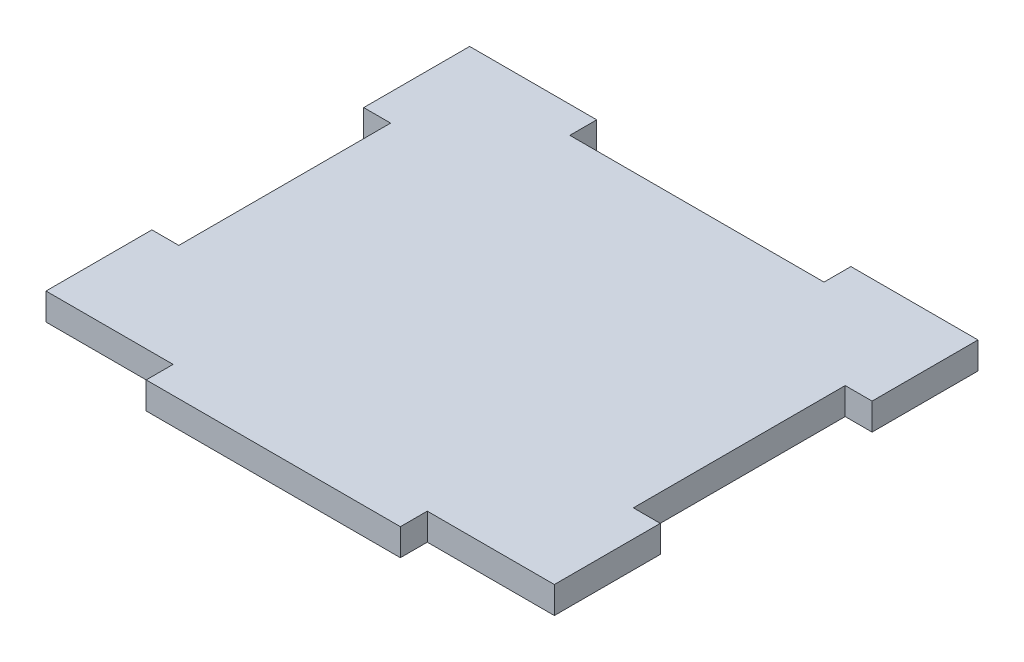
ISO-10303-21;
HEADER;
FILE_DESCRIPTION(('STEP AP214'),'2;1');
FILE_NAME('part.step','',(''),(''),'','','');
FILE_SCHEMA(('AUTOMOTIVE_DESIGN { 1 0 10303 214 1 1 1 1 }'));
ENDSEC;
DATA;
#1=APPLICATION_CONTEXT('core data for automotive mechanical design processes');
#2=APPLICATION_PROTOCOL_DEFINITION('international standard','automotive_design',2000,#1);
#3=PRODUCT_CONTEXT('',#1,'mechanical');
#4=PRODUCT('Part','Part','',(#3));
#5=PRODUCT_RELATED_PRODUCT_CATEGORY('part','',(#4));
#6=PRODUCT_DEFINITION_FORMATION('','',#4);
#7=PRODUCT_DEFINITION_CONTEXT('part definition',#1,'design');
#8=PRODUCT_DEFINITION('design','',#6,#7);
#9=PRODUCT_DEFINITION_SHAPE('','',#8);
#10=(LENGTH_UNIT() NAMED_UNIT(*) SI_UNIT(.MILLI.,.METRE.));
#11=(NAMED_UNIT(*) PLANE_ANGLE_UNIT() SI_UNIT($,.RADIAN.));
#12=(NAMED_UNIT(*) SI_UNIT($,.STERADIAN.) SOLID_ANGLE_UNIT());
#13=UNCERTAINTY_MEASURE_WITH_UNIT(LENGTH_MEASURE(1.E-05),#10,'distance_accuracy_value','');
#14=(GEOMETRIC_REPRESENTATION_CONTEXT(3) GLOBAL_UNCERTAINTY_ASSIGNED_CONTEXT((#13)) GLOBAL_UNIT_ASSIGNED_CONTEXT((#10,
#11,#12)) REPRESENTATION_CONTEXT('',''));
#15=CARTESIAN_POINT('',(0.,0.,0.));
#16=DIRECTION('',(0.,0.,1.));
#17=DIRECTION('',(1.,0.,0.));
#18=AXIS2_PLACEMENT_3D('',#15,#16,#17);
#19=CARTESIAN_POINT('',(30.,3.175,25.));
#20=DIRECTION('',(-1.,0.,0.));
#21=DIRECTION('',(0.,0.,1.));
#22=AXIS2_PLACEMENT_3D('',#19,#20,#21);
#23=PLANE('',#22);
#24=DIRECTION('',(0.,0.,-1.));
#25=VECTOR('',#24,1.);
#26=CARTESIAN_POINT('',(30.,0.,25.));
#27=LINE('',#26,#25);
#28=CARTESIAN_POINT('',(30.,0.,25.));
#29=VERTEX_POINT('',#28);
#30=CARTESIAN_POINT('',(30.,0.,12.5));
#31=VERTEX_POINT('',#30);
#32=EDGE_CURVE('E385',#29,#31,#27,.T.);
#33=ORIENTED_EDGE('',*,*,#32,.T.);
#34=DIRECTION('',(0.,1.,0.));
#35=VECTOR('',#34,1.);
#36=CARTESIAN_POINT('',(30.,0.,12.5));
#37=LINE('',#36,#35);
#38=CARTESIAN_POINT('',(30.,3.175,12.5));
#39=VERTEX_POINT('',#38);
#40=EDGE_CURVE('E277',#31,#39,#37,.T.);
#41=ORIENTED_EDGE('',*,*,#40,.T.);
#42=DIRECTION('',(0.,0.,-1.));
#43=VECTOR('',#42,1.);
#44=CARTESIAN_POINT('',(30.,3.175,25.));
#45=LINE('',#44,#43);
#46=CARTESIAN_POINT('',(30.,3.175,25.));
#47=VERTEX_POINT('',#46);
#48=EDGE_CURVE('E371',#47,#39,#45,.T.);
#49=ORIENTED_EDGE('',*,*,#48,.F.);
#50=DIRECTION('',(0.,-1.,0.));
#51=VECTOR('',#50,1.);
#52=CARTESIAN_POINT('',(30.,3.175,25.));
#53=LINE('',#52,#51);
#54=EDGE_CURVE('E219',#47,#29,#53,.T.);
#55=ORIENTED_EDGE('',*,*,#54,.T.);
#56=EDGE_LOOP('',(#33,#41,#49,#55));
#57=FACE_BOUND('',#56,.T.);
#58=ADVANCED_FACE('F39',(#57),#23,.F.);
#59=CARTESIAN_POINT('',(-30.,3.175,25.));
#60=DIRECTION('',(1.,0.,0.));
#61=DIRECTION('',(0.,0.,-1.));
#62=AXIS2_PLACEMENT_3D('',#59,#60,#61);
#63=PLANE('',#62);
#64=DIRECTION('',(0.,0.,1.));
#65=VECTOR('',#64,1.);
#66=CARTESIAN_POINT('',(-30.,0.,25.));
#67=LINE('',#66,#65);
#68=CARTESIAN_POINT('',(-30.,0.,-25.));
#69=VERTEX_POINT('',#68);
#70=CARTESIAN_POINT('',(-30.,0.,-12.5));
#71=VERTEX_POINT('',#70);
#72=EDGE_CURVE('E204',#69,#71,#67,.T.);
#73=ORIENTED_EDGE('',*,*,#72,.T.);
#74=DIRECTION('',(0.,1.,0.));
#75=VECTOR('',#74,1.);
#76=CARTESIAN_POINT('',(-30.,0.,-12.5));
#77=LINE('',#76,#75);
#78=CARTESIAN_POINT('',(-30.,3.175,-12.5));
#79=VERTEX_POINT('',#78);
#80=EDGE_CURVE('E257',#71,#79,#77,.T.);
#81=ORIENTED_EDGE('',*,*,#80,.T.);
#82=DIRECTION('',(0.,0.,1.));
#83=VECTOR('',#82,1.);
#84=CARTESIAN_POINT('',(-30.,3.175,25.));
#85=LINE('',#84,#83);
#86=CARTESIAN_POINT('',(-30.,3.175,-25.));
#87=VERTEX_POINT('',#86);
#88=EDGE_CURVE('E235',#87,#79,#85,.T.);
#89=ORIENTED_EDGE('',*,*,#88,.F.);
#90=DIRECTION('',(0.,-1.,0.));
#91=VECTOR('',#90,1.);
#92=CARTESIAN_POINT('',(-30.,3.175,-25.));
#93=LINE('',#92,#91);
#94=EDGE_CURVE('E48',#87,#69,#93,.T.);
#95=ORIENTED_EDGE('',*,*,#94,.T.);
#96=EDGE_LOOP('',(#73,#81,#89,#95));
#97=FACE_BOUND('',#96,.T.);
#98=ADVANCED_FACE('F232',(#97),#63,.F.);
#99=CARTESIAN_POINT('',(-30.,3.175,25.));
#100=DIRECTION('',(0.,0.,-1.));
#101=DIRECTION('',(-1.,0.,0.));
#102=AXIS2_PLACEMENT_3D('',#99,#100,#101);
#103=PLANE('',#102);
#104=DIRECTION('',(0.,1.,0.));
#105=VECTOR('',#104,1.);
#106=CARTESIAN_POINT('',(15.,-30.1675425747607,25.));
#107=LINE('',#106,#105);
#108=CARTESIAN_POINT('',(15.,0.,25.));
#109=VERTEX_POINT('',#108);
#110=CARTESIAN_POINT('',(15.,3.175,25.));
#111=VERTEX_POINT('',#110);
#112=EDGE_CURVE('E314',#109,#111,#107,.T.);
#113=ORIENTED_EDGE('',*,*,#112,.F.);
#114=DIRECTION('',(1.,0.,0.));
#115=VECTOR('',#114,1.);
#116=CARTESIAN_POINT('',(-30.,0.,25.));
#117=LINE('',#116,#115);
#118=EDGE_CURVE('E210',#109,#29,#117,.T.);
#119=ORIENTED_EDGE('',*,*,#118,.T.);
#120=ORIENTED_EDGE('',*,*,#54,.F.);
#121=DIRECTION('',(1.,0.,0.));
#122=VECTOR('',#121,1.);
#123=CARTESIAN_POINT('',(-30.,3.175,25.));
#124=LINE('',#123,#122);
#125=EDGE_CURVE('E382',#111,#47,#124,.T.);
#126=ORIENTED_EDGE('',*,*,#125,.F.);
#127=EDGE_LOOP('',(#113,#119,#120,#126));
#128=FACE_BOUND('',#127,.T.);
#129=ADVANCED_FACE('F413',(#128),#103,.F.);
#130=CARTESIAN_POINT('',(-30.,3.175,-25.));
#131=DIRECTION('',(0.,0.,1.));
#132=DIRECTION('',(1.,0.,0.));
#133=AXIS2_PLACEMENT_3D('',#130,#131,#132);
#134=PLANE('',#133);
#135=DIRECTION('',(-1.,0.,0.));
#136=VECTOR('',#135,1.);
#137=CARTESIAN_POINT('',(-30.,3.175,-25.));
#138=LINE('',#137,#136);
#139=CARTESIAN_POINT('',(-15.,3.175,-25.));
#140=VERTEX_POINT('',#139);
#141=EDGE_CURVE('E375',#140,#87,#138,.T.);
#142=ORIENTED_EDGE('',*,*,#141,.F.);
#143=DIRECTION('',(0.,1.,0.));
#144=VECTOR('',#143,1.);
#145=CARTESIAN_POINT('',(-15.,0.,-25.));
#146=LINE('',#145,#144);
#147=CARTESIAN_POINT('',(-15.,0.,-25.));
#148=VERTEX_POINT('',#147);
#149=EDGE_CURVE('E358',#148,#140,#146,.T.);
#150=ORIENTED_EDGE('',*,*,#149,.F.);
#151=DIRECTION('',(-1.,0.,0.));
#152=VECTOR('',#151,1.);
#153=CARTESIAN_POINT('',(-30.,0.,-25.));
#154=LINE('',#153,#152);
#155=EDGE_CURVE('E212',#148,#69,#154,.T.);
#156=ORIENTED_EDGE('',*,*,#155,.T.);
#157=ORIENTED_EDGE('',*,*,#94,.F.);
#158=EDGE_LOOP('',(#142,#150,#156,#157));
#159=FACE_BOUND('',#158,.T.);
#160=ADVANCED_FACE('F425',(#159),#134,.F.);
#161=CARTESIAN_POINT('',(30.,3.175,-12.5));
#162=VERTEX_POINT('',#161);
#163=CARTESIAN_POINT('',(30.,3.175,-25.));
#164=VERTEX_POINT('',#163);
#165=EDGE_CURVE('E218',#162,#164,#45,.T.);
#166=ORIENTED_EDGE('',*,*,#165,.F.);
#167=DIRECTION('',(0.,1.,0.));
#168=VECTOR('',#167,1.);
#169=CARTESIAN_POINT('',(30.,0.,-12.5));
#170=LINE('',#169,#168);
#171=CARTESIAN_POINT('',(30.,0.,-12.5));
#172=VERTEX_POINT('',#171);
#173=EDGE_CURVE('E293',#172,#162,#170,.T.);
#174=ORIENTED_EDGE('',*,*,#173,.F.);
#175=CARTESIAN_POINT('',(30.,0.,-25.));
#176=VERTEX_POINT('',#175);
#177=EDGE_CURVE('E361',#172,#176,#27,.T.);
#178=ORIENTED_EDGE('',*,*,#177,.T.);
#179=DIRECTION('',(0.,-1.,0.));
#180=VECTOR('',#179,1.);
#181=CARTESIAN_POINT('',(30.,3.175,-25.));
#182=LINE('',#181,#180);
#183=EDGE_CURVE('E11',#164,#176,#182,.T.);
#184=ORIENTED_EDGE('',*,*,#183,.F.);
#185=EDGE_LOOP('',(#166,#174,#178,#184));
#186=FACE_BOUND('',#185,.T.);
#187=ADVANCED_FACE('F41',(#186),#23,.F.);
#188=CARTESIAN_POINT('',(15.,0.,-25.));
#189=VERTEX_POINT('',#188);
#190=EDGE_CURVE('E205',#176,#189,#154,.T.);
#191=ORIENTED_EDGE('',*,*,#190,.T.);
#192=DIRECTION('',(0.,1.,0.));
#193=VECTOR('',#192,1.);
#194=CARTESIAN_POINT('',(15.,0.,-25.));
#195=LINE('',#194,#193);
#196=CARTESIAN_POINT('',(15.,3.175,-25.));
#197=VERTEX_POINT('',#196);
#198=EDGE_CURVE('E362',#189,#197,#195,.T.);
#199=ORIENTED_EDGE('',*,*,#198,.T.);
#200=EDGE_CURVE('E376',#164,#197,#138,.T.);
#201=ORIENTED_EDGE('',*,*,#200,.F.);
#202=ORIENTED_EDGE('',*,*,#183,.T.);
#203=EDGE_LOOP('',(#191,#199,#201,#202));
#204=FACE_BOUND('',#203,.T.);
#205=ADVANCED_FACE('F400',(#204),#134,.F.);
#206=CARTESIAN_POINT('',(-30.,3.175,12.5));
#207=VERTEX_POINT('',#206);
#208=CARTESIAN_POINT('',(-30.,3.175,25.));
#209=VERTEX_POINT('',#208);
#210=EDGE_CURVE('E194',#207,#209,#85,.T.);
#211=ORIENTED_EDGE('',*,*,#210,.F.);
#212=DIRECTION('',(0.,1.,0.));
#213=VECTOR('',#212,1.);
#214=CARTESIAN_POINT('',(-30.,0.,12.5));
#215=LINE('',#214,#213);
#216=CARTESIAN_POINT('',(-30.,0.,12.5));
#217=VERTEX_POINT('',#216);
#218=EDGE_CURVE('E180',#217,#207,#215,.T.);
#219=ORIENTED_EDGE('',*,*,#218,.F.);
#220=CARTESIAN_POINT('',(-30.,0.,25.));
#221=VERTEX_POINT('',#220);
#222=EDGE_CURVE('E192',#217,#221,#67,.T.);
#223=ORIENTED_EDGE('',*,*,#222,.T.);
#224=DIRECTION('',(0.,-1.,0.));
#225=VECTOR('',#224,1.);
#226=CARTESIAN_POINT('',(-30.,3.175,25.));
#227=LINE('',#226,#225);
#228=EDGE_CURVE('E223',#209,#221,#227,.T.);
#229=ORIENTED_EDGE('',*,*,#228,.F.);
#230=EDGE_LOOP('',(#211,#219,#223,#229));
#231=FACE_BOUND('',#230,.T.);
#232=ADVANCED_FACE('F190',(#231),#63,.F.);
#233=CARTESIAN_POINT('',(-15.,0.,25.));
#234=VERTEX_POINT('',#233);
#235=EDGE_CURVE('E202',#221,#234,#117,.T.);
#236=ORIENTED_EDGE('',*,*,#235,.T.);
#237=DIRECTION('',(0.,1.,0.));
#238=VECTOR('',#237,1.);
#239=CARTESIAN_POINT('',(-15.,-30.1675425747607,25.));
#240=LINE('',#239,#238);
#241=CARTESIAN_POINT('',(-15.,3.175,25.));
#242=VERTEX_POINT('',#241);
#243=EDGE_CURVE('E325',#234,#242,#240,.T.);
#244=ORIENTED_EDGE('',*,*,#243,.T.);
#245=EDGE_CURVE('E224',#209,#242,#124,.T.);
#246=ORIENTED_EDGE('',*,*,#245,.F.);
#247=ORIENTED_EDGE('',*,*,#228,.T.);
#248=EDGE_LOOP('',(#236,#244,#246,#247));
#249=FACE_BOUND('',#248,.T.);
#250=ADVANCED_FACE('F458',(#249),#103,.F.);
#251=CARTESIAN_POINT('',(0.,3.175,0.));
#252=DIRECTION('',(0.,-1.,0.));
#253=DIRECTION('',(0.,0.,-1.));
#254=AXIS2_PLACEMENT_3D('',#251,#252,#253);
#255=PLANE('',#254);
#256=ORIENTED_EDGE('',*,*,#88,.T.);
#257=DIRECTION('',(-1.,0.,0.));
#258=VECTOR('',#257,1.);
#259=CARTESIAN_POINT('',(-30.,3.175,-12.5));
#260=LINE('',#259,#258);
#261=CARTESIAN_POINT('',(-26.825,3.175,-12.5));
#262=VERTEX_POINT('',#261);
#263=EDGE_CURVE('E186',#262,#79,#260,.T.);
#264=ORIENTED_EDGE('',*,*,#263,.F.);
#265=DIRECTION('',(0.,0.,-1.));
#266=VECTOR('',#265,1.);
#267=CARTESIAN_POINT('',(-26.825,3.175,-12.5));
#268=LINE('',#267,#266);
#269=CARTESIAN_POINT('',(-26.825,3.175,12.5));
#270=VERTEX_POINT('',#269);
#271=EDGE_CURVE('E250',#270,#262,#268,.T.);
#272=ORIENTED_EDGE('',*,*,#271,.F.);
#273=DIRECTION('',(1.,0.,0.));
#274=VECTOR('',#273,1.);
#275=CARTESIAN_POINT('',(-30.,3.175,12.5));
#276=LINE('',#275,#274);
#277=EDGE_CURVE('E247',#207,#270,#276,.T.);
#278=ORIENTED_EDGE('',*,*,#277,.F.);
#279=ORIENTED_EDGE('',*,*,#210,.T.);
#280=ORIENTED_EDGE('',*,*,#245,.T.);
#281=DIRECTION('',(0.,0.,1.));
#282=VECTOR('',#281,1.);
#283=CARTESIAN_POINT('',(-15.0000000000001,3.175,0.));
#284=LINE('',#283,#282);
#285=CARTESIAN_POINT('',(-15.,3.175,28.175));
#286=VERTEX_POINT('',#285);
#287=EDGE_CURVE('E299',#242,#286,#284,.T.);
#288=ORIENTED_EDGE('',*,*,#287,.T.);
#289=DIRECTION('',(1.,0.,0.));
#290=VECTOR('',#289,1.);
#291=CARTESIAN_POINT('',(0.,3.175,28.175));
#292=LINE('',#291,#290);
#293=CARTESIAN_POINT('',(15.,3.175,28.175));
#294=VERTEX_POINT('',#293);
#295=EDGE_CURVE('E260',#286,#294,#292,.T.);
#296=ORIENTED_EDGE('',*,*,#295,.T.);
#297=DIRECTION('',(0.,0.,-1.));
#298=VECTOR('',#297,1.);
#299=CARTESIAN_POINT('',(14.9999999999999,3.175,0.));
#300=LINE('',#299,#298);
#301=EDGE_CURVE('E304',#294,#111,#300,.T.);
#302=ORIENTED_EDGE('',*,*,#301,.T.);
#303=ORIENTED_EDGE('',*,*,#125,.T.);
#304=ORIENTED_EDGE('',*,*,#48,.T.);
#305=DIRECTION('',(1.,0.,0.));
#306=VECTOR('',#305,1.);
#307=CARTESIAN_POINT('',(30.,3.175,12.5));
#308=LINE('',#307,#306);
#309=CARTESIAN_POINT('',(26.825,3.175,12.5));
#310=VERTEX_POINT('',#309);
#311=EDGE_CURVE('E278',#310,#39,#308,.T.);
#312=ORIENTED_EDGE('',*,*,#311,.F.);
#313=DIRECTION('',(0.,0.,1.));
#314=VECTOR('',#313,1.);
#315=CARTESIAN_POINT('',(26.825,3.175,-12.5));
#316=LINE('',#315,#314);
#317=CARTESIAN_POINT('',(26.825,3.175,-12.5));
#318=VERTEX_POINT('',#317);
#319=EDGE_CURVE('E271',#318,#310,#316,.T.);
#320=ORIENTED_EDGE('',*,*,#319,.F.);
#321=DIRECTION('',(-1.,0.,0.));
#322=VECTOR('',#321,1.);
#323=CARTESIAN_POINT('',(30.,3.175,-12.5));
#324=LINE('',#323,#322);
#325=EDGE_CURVE('E281',#162,#318,#324,.T.);
#326=ORIENTED_EDGE('',*,*,#325,.F.);
#327=ORIENTED_EDGE('',*,*,#165,.T.);
#328=ORIENTED_EDGE('',*,*,#200,.T.);
#329=DIRECTION('',(0.,0.,-1.));
#330=VECTOR('',#329,1.);
#331=CARTESIAN_POINT('',(15.,3.175,-25.));
#332=LINE('',#331,#330);
#333=CARTESIAN_POINT('',(15.,3.175,-21.825));
#334=VERTEX_POINT('',#333);
#335=EDGE_CURVE('E340',#334,#197,#332,.T.);
#336=ORIENTED_EDGE('',*,*,#335,.F.);
#337=DIRECTION('',(1.,0.,0.));
#338=VECTOR('',#337,1.);
#339=CARTESIAN_POINT('',(-15.,3.175,-21.825));
#340=LINE('',#339,#338);
#341=CARTESIAN_POINT('',(-15.,3.175,-21.825));
#342=VERTEX_POINT('',#341);
#343=EDGE_CURVE('E352',#342,#334,#340,.T.);
#344=ORIENTED_EDGE('',*,*,#343,.F.);
#345=DIRECTION('',(0.,0.,1.));
#346=VECTOR('',#345,1.);
#347=CARTESIAN_POINT('',(-15.,3.175,-25.));
#348=LINE('',#347,#346);
#349=EDGE_CURVE('E335',#140,#342,#348,.T.);
#350=ORIENTED_EDGE('',*,*,#349,.F.);
#351=ORIENTED_EDGE('',*,*,#141,.T.);
#352=EDGE_LOOP('',(#256,#264,#272,#278,#279,#280,#288,#296,#302,#303,#304,#312,#320,#326,#327,
#328,#336,#344,#350,#351));
#353=FACE_BOUND('',#352,.T.);
#354=ADVANCED_FACE('F403',(#353),#255,.F.);
#355=CARTESIAN_POINT('',(0.,0.,0.));
#356=DIRECTION('',(0.,-1.,0.));
#357=DIRECTION('',(0.,0.,-1.));
#358=AXIS2_PLACEMENT_3D('',#355,#356,#357);
#359=PLANE('',#358);
#360=DIRECTION('',(-1.,0.,0.));
#361=VECTOR('',#360,1.);
#362=CARTESIAN_POINT('',(-30.,0.,-12.5));
#363=LINE('',#362,#361);
#364=CARTESIAN_POINT('',(-26.825,0.,-12.5));
#365=VERTEX_POINT('',#364);
#366=EDGE_CURVE('E196',#365,#71,#363,.T.);
#367=ORIENTED_EDGE('',*,*,#366,.T.);
#368=ORIENTED_EDGE('',*,*,#72,.F.);
#369=ORIENTED_EDGE('',*,*,#155,.F.);
#370=DIRECTION('',(0.,0.,1.));
#371=VECTOR('',#370,1.);
#372=CARTESIAN_POINT('',(-15.,0.,-25.));
#373=LINE('',#372,#371);
#374=CARTESIAN_POINT('',(-15.,0.,-21.825));
#375=VERTEX_POINT('',#374);
#376=EDGE_CURVE('E336',#148,#375,#373,.T.);
#377=ORIENTED_EDGE('',*,*,#376,.T.);
#378=DIRECTION('',(1.,0.,0.));
#379=VECTOR('',#378,1.);
#380=CARTESIAN_POINT('',(-15.,0.,-21.825));
#381=LINE('',#380,#379);
#382=CARTESIAN_POINT('',(15.,0.,-21.825));
#383=VERTEX_POINT('',#382);
#384=EDGE_CURVE('E339',#375,#383,#381,.T.);
#385=ORIENTED_EDGE('',*,*,#384,.T.);
#386=DIRECTION('',(0.,0.,-1.));
#387=VECTOR('',#386,1.);
#388=CARTESIAN_POINT('',(15.,0.,-25.));
#389=LINE('',#388,#387);
#390=EDGE_CURVE('E344',#383,#189,#389,.T.);
#391=ORIENTED_EDGE('',*,*,#390,.T.);
#392=ORIENTED_EDGE('',*,*,#190,.F.);
#393=ORIENTED_EDGE('',*,*,#177,.F.);
#394=DIRECTION('',(-1.,0.,0.));
#395=VECTOR('',#394,1.);
#396=CARTESIAN_POINT('',(30.,0.,-12.5));
#397=LINE('',#396,#395);
#398=CARTESIAN_POINT('',(26.825,0.,-12.5));
#399=VERTEX_POINT('',#398);
#400=EDGE_CURVE('E270',#172,#399,#397,.T.);
#401=ORIENTED_EDGE('',*,*,#400,.T.);
#402=DIRECTION('',(0.,0.,1.));
#403=VECTOR('',#402,1.);
#404=CARTESIAN_POINT('',(26.825,0.,-12.5));
#405=LINE('',#404,#403);
#406=CARTESIAN_POINT('',(26.825,0.,12.5));
#407=VERTEX_POINT('',#406);
#408=EDGE_CURVE('E63',#399,#407,#405,.T.);
#409=ORIENTED_EDGE('',*,*,#408,.T.);
#410=DIRECTION('',(1.,0.,0.));
#411=VECTOR('',#410,1.);
#412=CARTESIAN_POINT('',(30.,0.,12.5));
#413=LINE('',#412,#411);
#414=EDGE_CURVE('E266',#407,#31,#413,.T.);
#415=ORIENTED_EDGE('',*,*,#414,.T.);
#416=ORIENTED_EDGE('',*,*,#32,.F.);
#417=ORIENTED_EDGE('',*,*,#118,.F.);
#418=DIRECTION('',(0.,0.,-1.));
#419=VECTOR('',#418,1.);
#420=CARTESIAN_POINT('',(14.9999999999999,0.,0.));
#421=LINE('',#420,#419);
#422=CARTESIAN_POINT('',(15.,0.,28.175));
#423=VERTEX_POINT('',#422);
#424=EDGE_CURVE('E303',#423,#109,#421,.T.);
#425=ORIENTED_EDGE('',*,*,#424,.F.);
#426=DIRECTION('',(1.,0.,0.));
#427=VECTOR('',#426,1.);
#428=CARTESIAN_POINT('',(0.,0.,28.175));
#429=LINE('',#428,#427);
#430=CARTESIAN_POINT('',(-15.,0.,28.175));
#431=VERTEX_POINT('',#430);
#432=EDGE_CURVE('E315',#431,#423,#429,.T.);
#433=ORIENTED_EDGE('',*,*,#432,.F.);
#434=DIRECTION('',(0.,0.,1.));
#435=VECTOR('',#434,1.);
#436=CARTESIAN_POINT('',(-15.0000000000001,0.,0.));
#437=LINE('',#436,#435);
#438=EDGE_CURVE('E321',#234,#431,#437,.T.);
#439=ORIENTED_EDGE('',*,*,#438,.F.);
#440=ORIENTED_EDGE('',*,*,#235,.F.);
#441=ORIENTED_EDGE('',*,*,#222,.F.);
#442=DIRECTION('',(1.,0.,0.));
#443=VECTOR('',#442,1.);
#444=CARTESIAN_POINT('',(-30.,0.,12.5));
#445=LINE('',#444,#443);
#446=CARTESIAN_POINT('',(-26.825,0.,12.5));
#447=VERTEX_POINT('',#446);
#448=EDGE_CURVE('E176',#217,#447,#445,.T.);
#449=ORIENTED_EDGE('',*,*,#448,.T.);
#450=DIRECTION('',(0.,0.,-1.));
#451=VECTOR('',#450,1.);
#452=CARTESIAN_POINT('',(-26.825,0.,-12.5));
#453=LINE('',#452,#451);
#454=EDGE_CURVE('E55',#447,#365,#453,.T.);
#455=ORIENTED_EDGE('',*,*,#454,.T.);
#456=EDGE_LOOP('',(#367,#368,#369,#377,#385,#391,#392,#393,#401,#409,#415,#416,#417,#425,#433,
#439,#440,#441,#449,#455));
#457=FACE_BOUND('',#456,.T.);
#458=ADVANCED_FACE('F200',(#457),#359,.T.);
#459=CARTESIAN_POINT('',(-15.,0.,-25.));
#460=DIRECTION('',(-1.,0.,0.));
#461=DIRECTION('',(0.,0.,1.));
#462=AXIS2_PLACEMENT_3D('',#459,#460,#461);
#463=PLANE('',#462);
#464=ORIENTED_EDGE('',*,*,#349,.T.);
#465=DIRECTION('',(0.,1.,0.));
#466=VECTOR('',#465,1.);
#467=CARTESIAN_POINT('',(-15.,0.,-21.825));
#468=LINE('',#467,#466);
#469=EDGE_CURVE('E348',#375,#342,#468,.T.);
#470=ORIENTED_EDGE('',*,*,#469,.F.);
#471=ORIENTED_EDGE('',*,*,#376,.F.);
#472=ORIENTED_EDGE('',*,*,#149,.T.);
#473=EDGE_LOOP('',(#464,#470,#471,#472));
#474=FACE_BOUND('',#473,.T.);
#475=ADVANCED_FACE('F427',(#474),#463,.F.);
#476=CARTESIAN_POINT('',(15.,0.,-25.));
#477=DIRECTION('',(1.,0.,0.));
#478=DIRECTION('',(0.,0.,-1.));
#479=AXIS2_PLACEMENT_3D('',#476,#477,#478);
#480=PLANE('',#479);
#481=ORIENTED_EDGE('',*,*,#335,.T.);
#482=ORIENTED_EDGE('',*,*,#198,.F.);
#483=ORIENTED_EDGE('',*,*,#390,.F.);
#484=DIRECTION('',(0.,1.,0.));
#485=VECTOR('',#484,1.);
#486=CARTESIAN_POINT('',(15.,0.,-21.825));
#487=LINE('',#486,#485);
#488=EDGE_CURVE('E366',#383,#334,#487,.T.);
#489=ORIENTED_EDGE('',*,*,#488,.T.);
#490=EDGE_LOOP('',(#481,#482,#483,#489));
#491=FACE_BOUND('',#490,.T.);
#492=ADVANCED_FACE('F433',(#491),#480,.F.);
#493=CARTESIAN_POINT('',(-15.,0.,-21.825));
#494=DIRECTION('',(0.,0.,1.));
#495=DIRECTION('',(1.,0.,0.));
#496=AXIS2_PLACEMENT_3D('',#493,#494,#495);
#497=PLANE('',#496);
#498=ORIENTED_EDGE('',*,*,#343,.T.);
#499=ORIENTED_EDGE('',*,*,#488,.F.);
#500=ORIENTED_EDGE('',*,*,#384,.F.);
#501=ORIENTED_EDGE('',*,*,#469,.T.);
#502=EDGE_LOOP('',(#498,#499,#500,#501));
#503=FACE_BOUND('',#502,.T.);
#504=ADVANCED_FACE('F431',(#503),#497,.F.);
#505=CARTESIAN_POINT('',(14.9999999999999,-30.1675425747607,0.));
#506=DIRECTION('',(1.,0.,0.));
#507=DIRECTION('',(0.,0.,-1.));
#508=AXIS2_PLACEMENT_3D('',#505,#506,#507);
#509=PLANE('',#508);
#510=DIRECTION('',(0.,1.,0.));
#511=VECTOR('',#510,1.);
#512=CARTESIAN_POINT('',(15.,-30.1675425747607,28.175));
#513=LINE('',#512,#511);
#514=EDGE_CURVE('E319',#423,#294,#513,.T.);
#515=ORIENTED_EDGE('',*,*,#514,.F.);
#516=ORIENTED_EDGE('',*,*,#424,.T.);
#517=ORIENTED_EDGE('',*,*,#112,.T.);
#518=ORIENTED_EDGE('',*,*,#301,.F.);
#519=EDGE_LOOP('',(#515,#516,#517,#518));
#520=FACE_BOUND('',#519,.T.);
#521=ADVANCED_FACE('F440',(#520),#509,.T.);
#522=CARTESIAN_POINT('',(-15.0000000000001,-30.1675425747607,0.));
#523=DIRECTION('',(-1.,0.,0.));
#524=DIRECTION('',(0.,0.,1.));
#525=AXIS2_PLACEMENT_3D('',#522,#523,#524);
#526=PLANE('',#525);
#527=ORIENTED_EDGE('',*,*,#243,.F.);
#528=ORIENTED_EDGE('',*,*,#438,.T.);
#529=DIRECTION('',(0.,1.,0.));
#530=VECTOR('',#529,1.);
#531=CARTESIAN_POINT('',(-15.,-30.1675425747607,28.175));
#532=LINE('',#531,#530);
#533=EDGE_CURVE('E320',#431,#286,#532,.T.);
#534=ORIENTED_EDGE('',*,*,#533,.T.);
#535=ORIENTED_EDGE('',*,*,#287,.F.);
#536=EDGE_LOOP('',(#527,#528,#534,#535));
#537=FACE_BOUND('',#536,.T.);
#538=ADVANCED_FACE('F515',(#537),#526,.T.);
#539=CARTESIAN_POINT('',(0.,-30.1675425747607,28.175));
#540=DIRECTION('',(0.,0.,1.));
#541=DIRECTION('',(1.,0.,0.));
#542=AXIS2_PLACEMENT_3D('',#539,#540,#541);
#543=PLANE('',#542);
#544=ORIENTED_EDGE('',*,*,#533,.F.);
#545=ORIENTED_EDGE('',*,*,#432,.T.);
#546=ORIENTED_EDGE('',*,*,#514,.T.);
#547=ORIENTED_EDGE('',*,*,#295,.F.);
#548=EDGE_LOOP('',(#544,#545,#546,#547));
#549=FACE_BOUND('',#548,.T.);
#550=ADVANCED_FACE('F524',(#549),#543,.T.);
#551=CARTESIAN_POINT('',(30.,0.,12.5));
#552=DIRECTION('',(0.,0.,1.));
#553=DIRECTION('',(1.,0.,0.));
#554=AXIS2_PLACEMENT_3D('',#551,#552,#553);
#555=PLANE('',#554);
#556=ORIENTED_EDGE('',*,*,#311,.T.);
#557=ORIENTED_EDGE('',*,*,#40,.F.);
#558=ORIENTED_EDGE('',*,*,#414,.F.);
#559=DIRECTION('',(0.,1.,0.));
#560=VECTOR('',#559,1.);
#561=CARTESIAN_POINT('',(26.825,0.,12.5));
#562=LINE('',#561,#560);
#563=EDGE_CURVE('E251',#407,#310,#562,.T.);
#564=ORIENTED_EDGE('',*,*,#563,.T.);
#565=EDGE_LOOP('',(#556,#557,#558,#564));
#566=FACE_BOUND('',#565,.T.);
#567=ADVANCED_FACE('F417',(#566),#555,.F.);
#568=CARTESIAN_POINT('',(26.825,0.,-12.5));
#569=DIRECTION('',(-1.,0.,0.));
#570=DIRECTION('',(0.,0.,1.));
#571=AXIS2_PLACEMENT_3D('',#568,#569,#570);
#572=PLANE('',#571);
#573=ORIENTED_EDGE('',*,*,#319,.T.);
#574=ORIENTED_EDGE('',*,*,#563,.F.);
#575=ORIENTED_EDGE('',*,*,#408,.F.);
#576=DIRECTION('',(0.,1.,0.));
#577=VECTOR('',#576,1.);
#578=CARTESIAN_POINT('',(26.825,0.,-12.5));
#579=LINE('',#578,#577);
#580=EDGE_CURVE('E290',#399,#318,#579,.T.);
#581=ORIENTED_EDGE('',*,*,#580,.T.);
#582=EDGE_LOOP('',(#573,#574,#575,#581));
#583=FACE_BOUND('',#582,.T.);
#584=ADVANCED_FACE('F564',(#583),#572,.F.);
#585=CARTESIAN_POINT('',(30.,0.,-12.5));
#586=DIRECTION('',(0.,0.,-1.));
#587=DIRECTION('',(-1.,0.,0.));
#588=AXIS2_PLACEMENT_3D('',#585,#586,#587);
#589=PLANE('',#588);
#590=ORIENTED_EDGE('',*,*,#325,.T.);
#591=ORIENTED_EDGE('',*,*,#580,.F.);
#592=ORIENTED_EDGE('',*,*,#400,.F.);
#593=ORIENTED_EDGE('',*,*,#173,.T.);
#594=EDGE_LOOP('',(#590,#591,#592,#593));
#595=FACE_BOUND('',#594,.T.);
#596=ADVANCED_FACE('F572',(#595),#589,.F.);
#597=CARTESIAN_POINT('',(-30.,0.,-12.5));
#598=DIRECTION('',(0.,0.,-1.));
#599=DIRECTION('',(-1.,0.,0.));
#600=AXIS2_PLACEMENT_3D('',#597,#598,#599);
#601=PLANE('',#600);
#602=ORIENTED_EDGE('',*,*,#263,.T.);
#603=ORIENTED_EDGE('',*,*,#80,.F.);
#604=ORIENTED_EDGE('',*,*,#366,.F.);
#605=DIRECTION('',(0.,1.,0.));
#606=VECTOR('',#605,1.);
#607=CARTESIAN_POINT('',(-26.825,0.,-12.5));
#608=LINE('',#607,#606);
#609=EDGE_CURVE('E261',#365,#262,#608,.T.);
#610=ORIENTED_EDGE('',*,*,#609,.T.);
#611=EDGE_LOOP('',(#602,#603,#604,#610));
#612=FACE_BOUND('',#611,.T.);
#613=ADVANCED_FACE('F580',(#612),#601,.F.);
#614=CARTESIAN_POINT('',(-26.825,0.,-12.5));
#615=DIRECTION('',(1.,0.,0.));
#616=DIRECTION('',(0.,0.,-1.));
#617=AXIS2_PLACEMENT_3D('',#614,#615,#616);
#618=PLANE('',#617);
#619=ORIENTED_EDGE('',*,*,#271,.T.);
#620=ORIENTED_EDGE('',*,*,#609,.F.);
#621=ORIENTED_EDGE('',*,*,#454,.F.);
#622=DIRECTION('',(0.,1.,0.));
#623=VECTOR('',#622,1.);
#624=CARTESIAN_POINT('',(-26.825,0.,12.5));
#625=LINE('',#624,#623);
#626=EDGE_CURVE('E182',#447,#270,#625,.T.);
#627=ORIENTED_EDGE('',*,*,#626,.T.);
#628=EDGE_LOOP('',(#619,#620,#621,#627));
#629=FACE_BOUND('',#628,.T.);
#630=ADVANCED_FACE('F589',(#629),#618,.F.);
#631=CARTESIAN_POINT('',(-30.,0.,12.5));
#632=DIRECTION('',(0.,0.,1.));
#633=DIRECTION('',(1.,0.,0.));
#634=AXIS2_PLACEMENT_3D('',#631,#632,#633);
#635=PLANE('',#634);
#636=ORIENTED_EDGE('',*,*,#277,.T.);
#637=ORIENTED_EDGE('',*,*,#626,.F.);
#638=ORIENTED_EDGE('',*,*,#448,.F.);
#639=ORIENTED_EDGE('',*,*,#218,.T.);
#640=EDGE_LOOP('',(#636,#637,#638,#639));
#641=FACE_BOUND('',#640,.T.);
#642=ADVANCED_FACE('F179',(#641),#635,.F.);
#643=CLOSED_SHELL('',(#58,#98,#129,#160,#187,#205,#232,#250,#354,#458,#475,#492,#504,#521,#538,
#550,#567,#584,#596,#613,#630,#642));
#644=MANIFOLD_SOLID_BREP('B2',#643);
#645=ADVANCED_BREP_SHAPE_REPRESENTATION('',(#18,#644),#14);
#646=SHAPE_DEFINITION_REPRESENTATION(#9,#645);
ENDSEC;
END-ISO-10303-21;
